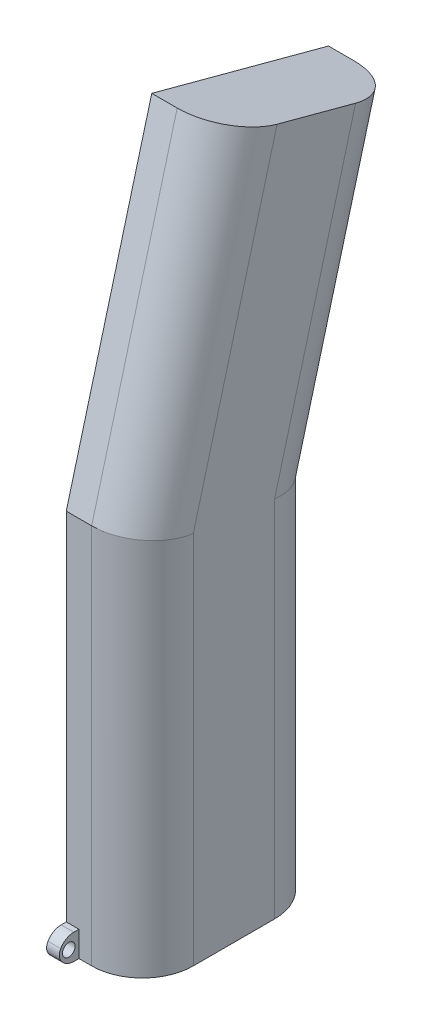
ISO-10303-21;
HEADER;
FILE_DESCRIPTION(('STEP AP214'),'2;1');
FILE_NAME('part.step','',(''),(''),'','','');
FILE_SCHEMA(('AUTOMOTIVE_DESIGN { 1 0 10303 214 1 1 1 1 }'));
ENDSEC;
DATA;
#1=APPLICATION_CONTEXT('core data for automotive mechanical design processes');
#2=APPLICATION_PROTOCOL_DEFINITION('international standard','automotive_design',2000,#1);
#3=PRODUCT_CONTEXT('',#1,'mechanical');
#4=PRODUCT('Part','Part','',(#3));
#5=PRODUCT_RELATED_PRODUCT_CATEGORY('part','',(#4));
#6=PRODUCT_DEFINITION_FORMATION('','',#4);
#7=PRODUCT_DEFINITION_CONTEXT('part definition',#1,'design');
#8=PRODUCT_DEFINITION('design','',#6,#7);
#9=PRODUCT_DEFINITION_SHAPE('','',#8);
#10=(LENGTH_UNIT() NAMED_UNIT(*) SI_UNIT(.MILLI.,.METRE.));
#11=(NAMED_UNIT(*) PLANE_ANGLE_UNIT() SI_UNIT($,.RADIAN.));
#12=(NAMED_UNIT(*) SI_UNIT($,.STERADIAN.) SOLID_ANGLE_UNIT());
#13=UNCERTAINTY_MEASURE_WITH_UNIT(LENGTH_MEASURE(1.E-05),#10,'distance_accuracy_value','');
#14=(GEOMETRIC_REPRESENTATION_CONTEXT(3) GLOBAL_UNCERTAINTY_ASSIGNED_CONTEXT((#13)) GLOBAL_UNIT_ASSIGNED_CONTEXT((#10,
#11,#12)) REPRESENTATION_CONTEXT('',''));
#15=CARTESIAN_POINT('',(0.,0.,0.));
#16=DIRECTION('',(0.,0.,1.));
#17=DIRECTION('',(1.,0.,0.));
#18=AXIS2_PLACEMENT_3D('',#15,#16,#17);
#19=CARTESIAN_POINT('',(15.,0.,-18.));
#20=DIRECTION('',(0.,0.,1.));
#21=DIRECTION('',(-1.,0.,0.));
#22=AXIS2_PLACEMENT_3D('',#19,#20,#21);
#23=PLANE('',#22);
#24=DIRECTION('',(0.,1.,0.));
#25=VECTOR('',#24,1.);
#26=CARTESIAN_POINT('',(2.5,0.,-18.));
#27=LINE('',#26,#25);
#28=CARTESIAN_POINT('',(2.5,0.,-18.));
#29=VERTEX_POINT('',#28);
#30=CARTESIAN_POINT('',(2.5,5.,-18.));
#31=VERTEX_POINT('',#30);
#32=EDGE_CURVE('E248',#29,#31,#27,.T.);
#33=ORIENTED_EDGE('',*,*,#32,.T.);
#34=DIRECTION('',(-1.,0.,0.));
#35=VECTOR('',#34,1.);
#36=CARTESIAN_POINT('',(0.,5.,-18.));
#37=LINE('',#36,#35);
#38=CARTESIAN_POINT('',(0.,5.,-18.));
#39=VERTEX_POINT('',#38);
#40=EDGE_CURVE('E259',#31,#39,#37,.T.);
#41=ORIENTED_EDGE('',*,*,#40,.T.);
#42=DIRECTION('',(0.,-1.,0.));
#43=VECTOR('',#42,1.);
#44=CARTESIAN_POINT('',(0.,0.,-18.));
#45=LINE('',#44,#43);
#46=CARTESIAN_POINT('',(0.,70.2605100868536,-18.));
#47=VERTEX_POINT('',#46);
#48=EDGE_CURVE('E360',#47,#39,#45,.T.);
#49=ORIENTED_EDGE('',*,*,#48,.F.);
#50=DIRECTION('',(-1.,0.,0.));
#51=VECTOR('',#50,1.);
#52=CARTESIAN_POINT('',(15.,70.2605100868536,-18.));
#53=LINE('',#52,#51);
#54=CARTESIAN_POINT('',(5.,70.2605100868536,-18.));
#55=VERTEX_POINT('',#54);
#56=EDGE_CURVE('E359',#55,#47,#53,.T.);
#57=ORIENTED_EDGE('',*,*,#56,.F.);
#58=DIRECTION('',(0.,-1.,0.));
#59=VECTOR('',#58,1.);
#60=CARTESIAN_POINT('',(5.,0.,-18.));
#61=LINE('',#60,#59);
#62=CARTESIAN_POINT('',(5.,0.,-18.));
#63=VERTEX_POINT('',#62);
#64=EDGE_CURVE('E251',#63,#55,#61,.F.);
#65=ORIENTED_EDGE('',*,*,#64,.F.);
#66=DIRECTION('',(-1.,0.,0.));
#67=VECTOR('',#66,1.);
#68=CARTESIAN_POINT('',(15.,0.,-18.));
#69=LINE('',#68,#67);
#70=EDGE_CURVE('E235',#63,#29,#69,.T.);
#71=ORIENTED_EDGE('',*,*,#70,.T.);
#72=EDGE_LOOP('',(#33,#41,#49,#57,#65,#71));
#73=FACE_BOUND('',#72,.T.);
#74=ADVANCED_FACE('F35',(#73),#23,.F.);
#75=CARTESIAN_POINT('',(0.,0.,0.));
#76=DIRECTION('',(-1.,0.,0.));
#77=DIRECTION('',(0.,0.,-1.));
#78=AXIS2_PLACEMENT_3D('',#75,#76,#77);
#79=PLANE('',#78);
#80=CARTESIAN_POINT('',(0.,2.5,20.));
#81=DIRECTION('',(1.,0.,0.));
#82=DIRECTION('',(0.,0.,-1.));
#83=AXIS2_PLACEMENT_3D('',#80,#81,#82);
#84=CIRCLE('',#83,1.25);
#85=CARTESIAN_POINT('',(0.,2.5,18.75));
#86=VERTEX_POINT('',#85);
#87=EDGE_CURVE('E495',#86,#86,#84,.T.);
#88=ORIENTED_EDGE('',*,*,#87,.T.);
#89=EDGE_LOOP('',(#88));
#90=FACE_BOUND('',#89,.T.);
#91=CARTESIAN_POINT('',(0.,2.5,-20.));
#92=DIRECTION('',(1.,0.,0.));
#93=DIRECTION('',(0.,0.,-1.));
#94=AXIS2_PLACEMENT_3D('',#91,#92,#93);
#95=CIRCLE('',#94,1.25);
#96=CARTESIAN_POINT('',(0.,2.5,-21.25));
#97=VERTEX_POINT('',#96);
#98=EDGE_CURVE('E265',#97,#97,#95,.F.);
#99=ORIENTED_EDGE('',*,*,#98,.F.);
#100=EDGE_LOOP('',(#99));
#101=FACE_BOUND('',#100,.T.);
#102=CARTESIAN_POINT('',(0.,2.,19.));
#103=DIRECTION('',(1.,0.,0.));
#104=DIRECTION('',(0.,0.,-1.));
#105=AXIS2_PLACEMENT_3D('',#102,#103,#104);
#106=CIRCLE('',#105,3.);
#107=CARTESIAN_POINT('',(0.,5.,19.));
#108=VERTEX_POINT('',#107);
#109=CARTESIAN_POINT('',(0.,3.50000000000001,21.5980762113533));
#110=VERTEX_POINT('',#109);
#111=EDGE_CURVE('E449',#108,#110,#106,.T.);
#112=ORIENTED_EDGE('',*,*,#111,.F.);
#113=DIRECTION('',(0.,0.,-1.));
#114=VECTOR('',#113,1.);
#115=CARTESIAN_POINT('',(0.,5.,22.));
#116=LINE('',#115,#114);
#117=CARTESIAN_POINT('',(0.,5.,18.));
#118=VERTEX_POINT('',#117);
#119=EDGE_CURVE('E473',#108,#118,#116,.T.);
#120=ORIENTED_EDGE('',*,*,#119,.T.);
#121=DIRECTION('',(0.,1.,0.));
#122=VECTOR('',#121,1.);
#123=CARTESIAN_POINT('',(0.,0.,18.));
#124=LINE('',#123,#122);
#125=CARTESIAN_POINT('',(0.,75.,18.));
#126=VERTEX_POINT('',#125);
#127=EDGE_CURVE('E368',#118,#126,#124,.T.);
#128=ORIENTED_EDGE('',*,*,#127,.T.);
#129=DIRECTION('',(0.,0.965925826289067,-0.258819045102525));
#130=VECTOR('',#129,1.);
#131=CARTESIAN_POINT('',(0.,75.,18.));
#132=LINE('',#131,#130);
#133=CARTESIAN_POINT('',(0.,137.785178708789,1.17676206833585));
#134=VERTEX_POINT('',#133);
#135=EDGE_CURVE('E371',#126,#134,#132,.T.);
#136=ORIENTED_EDGE('',*,*,#135,.T.);
#137=DIRECTION('',(0.,-0.258819045102526,-0.965925826289067));
#138=VECTOR('',#137,1.);
#139=CARTESIAN_POINT('',(0.,137.785178708789,1.17676206833585));
#140=LINE('',#139,#138);
#141=CARTESIAN_POINT('',(0.,128.467693085098,-33.5965676780706));
#142=VERTEX_POINT('',#141);
#143=EDGE_CURVE('E374',#134,#142,#140,.T.);
#144=ORIENTED_EDGE('',*,*,#143,.T.);
#145=DIRECTION('',(0.,-0.965925826289067,0.258819045102525));
#146=VECTOR('',#145,1.);
#147=CARTESIAN_POINT('',(0.,70.2605100868536,-18.));
#148=LINE('',#147,#146);
#149=EDGE_CURVE('E356',#142,#47,#148,.T.);
#150=ORIENTED_EDGE('',*,*,#149,.T.);
#151=ORIENTED_EDGE('',*,*,#48,.T.);
#152=DIRECTION('',(0.,0.,1.));
#153=VECTOR('',#152,1.);
#154=CARTESIAN_POINT('',(0.,5.,-22.));
#155=LINE('',#154,#153);
#156=CARTESIAN_POINT('',(0.,5.,-19.));
#157=VERTEX_POINT('',#156);
#158=EDGE_CURVE('E262',#157,#39,#155,.T.);
#159=ORIENTED_EDGE('',*,*,#158,.F.);
#160=CARTESIAN_POINT('',(0.,2.,-19.));
#161=DIRECTION('',(1.,0.,0.));
#162=DIRECTION('',(0.,0.,-1.));
#163=AXIS2_PLACEMENT_3D('',#160,#161,#162);
#164=CIRCLE('',#163,3.);
#165=CARTESIAN_POINT('',(0.,3.5,-21.5980762113533));
#166=VERTEX_POINT('',#165);
#167=EDGE_CURVE('E423',#166,#157,#164,.T.);
#168=ORIENTED_EDGE('',*,*,#167,.F.);
#169=CARTESIAN_POINT('',(0.,2.5,-19.8660254037844));
#170=DIRECTION('',(1.,0.,0.));
#171=DIRECTION('',(0.,0.,-1.));
#172=AXIS2_PLACEMENT_3D('',#169,#170,#171);
#173=CIRCLE('',#172,2.);
#174=CARTESIAN_POINT('',(0.,1.5,-21.5980762113533));
#175=VERTEX_POINT('',#174);
#176=EDGE_CURVE('E433',#175,#166,#173,.T.);
#177=ORIENTED_EDGE('',*,*,#176,.F.);
#178=CARTESIAN_POINT('',(0.,3.,-19.));
#179=DIRECTION('',(1.,0.,0.));
#180=DIRECTION('',(0.,0.,-1.));
#181=AXIS2_PLACEMENT_3D('',#178,#179,#180);
#182=CIRCLE('',#181,3.);
#183=CARTESIAN_POINT('',(0.,0.,-19.));
#184=VERTEX_POINT('',#183);
#185=EDGE_CURVE('E426',#184,#175,#182,.T.);
#186=ORIENTED_EDGE('',*,*,#185,.F.);
#187=DIRECTION('',(0.,0.,1.));
#188=VECTOR('',#187,1.);
#189=CARTESIAN_POINT('',(0.,0.,-18.));
#190=LINE('',#189,#188);
#191=CARTESIAN_POINT('',(0.,0.,-3.1));
#192=VERTEX_POINT('',#191);
#193=EDGE_CURVE('E365',#184,#192,#190,.T.);
#194=ORIENTED_EDGE('',*,*,#193,.T.);
#195=DIRECTION('',(0.,-1.,0.));
#196=VECTOR('',#195,1.);
#197=CARTESIAN_POINT('',(0.,137.786178708789,-3.10000000000003));
#198=LINE('',#197,#196);
#199=CARTESIAN_POINT('',(0.,2.,-3.1));
#200=VERTEX_POINT('',#199);
#201=EDGE_CURVE('E276',#200,#192,#198,.T.);
#202=ORIENTED_EDGE('',*,*,#201,.F.);
#203=DIRECTION('',(0.,0.,1.));
#204=VECTOR('',#203,1.);
#205=CARTESIAN_POINT('',(0.,2.,0.));
#206=LINE('',#205,#204);
#207=CARTESIAN_POINT('',(0.,2.,-16.));
#208=VERTEX_POINT('',#207);
#209=EDGE_CURVE('E349',#208,#200,#206,.T.);
#210=ORIENTED_EDGE('',*,*,#209,.F.);
#211=DIRECTION('',(0.,-1.,0.));
#212=VECTOR('',#211,1.);
#213=CARTESIAN_POINT('',(0.,0.,-16.));
#214=LINE('',#213,#212);
#215=CARTESIAN_POINT('',(0.,70.5238150820284,-16.));
#216=VERTEX_POINT('',#215);
#217=EDGE_CURVE('E325',#216,#208,#214,.T.);
#218=ORIENTED_EDGE('',*,*,#217,.F.);
#219=DIRECTION('',(0.,-0.965925826289067,0.258819045102525));
#220=VECTOR('',#219,1.);
#221=CARTESIAN_POINT('',(0.,0.724199824597937,2.70275054023192));
#222=LINE('',#221,#220);
#223=CARTESIAN_POINT('',(0.,127.053479522725,-31.1470779352874));
#224=VERTEX_POINT('',#223);
#225=EDGE_CURVE('E297',#224,#216,#222,.T.);
#226=ORIENTED_EDGE('',*,*,#225,.F.);
#227=DIRECTION('',(0.,-0.258819045102526,-0.965925826289067));
#228=VECTOR('',#227,1.);
#229=CARTESIAN_POINT('',(0.,126.329279698127,-33.8498284755193));
#230=LINE('',#229,#228);
#231=CARTESIAN_POINT('',(0.,135.335688966006,-0.237451494037231));
#232=VERTEX_POINT('',#231);
#233=EDGE_CURVE('E340',#232,#224,#230,.T.);
#234=ORIENTED_EDGE('',*,*,#233,.F.);
#235=DIRECTION('',(0.,0.965925826289067,-0.258819045102525));
#236=VECTOR('',#235,1.);
#237=CARTESIAN_POINT('',(0.,9.00640926787875,33.6123769814821));
#238=LINE('',#237,#236);
#239=CARTESIAN_POINT('',(0.,74.7366950048252,16.));
#240=VERTEX_POINT('',#239);
#241=EDGE_CURVE('E343',#240,#232,#238,.T.);
#242=ORIENTED_EDGE('',*,*,#241,.F.);
#243=DIRECTION('',(0.,1.,0.));
#244=VECTOR('',#243,1.);
#245=CARTESIAN_POINT('',(0.,0.,16.));
#246=LINE('',#245,#244);
#247=CARTESIAN_POINT('',(0.,2.00000000000001,16.));
#248=VERTEX_POINT('',#247);
#249=EDGE_CURVE('E346',#248,#240,#246,.T.);
#250=ORIENTED_EDGE('',*,*,#249,.F.);
#251=CARTESIAN_POINT('',(0.,2.,3.1));
#252=VERTEX_POINT('',#251);
#253=EDGE_CURVE('E337',#252,#248,#206,.T.);
#254=ORIENTED_EDGE('',*,*,#253,.F.);
#255=DIRECTION('',(0.,-1.,0.));
#256=VECTOR('',#255,1.);
#257=CARTESIAN_POINT('',(0.,137.786178708789,3.09999999999997));
#258=LINE('',#257,#256);
#259=CARTESIAN_POINT('',(0.,0.,3.1));
#260=VERTEX_POINT('',#259);
#261=EDGE_CURVE('E274',#252,#260,#258,.T.);
#262=ORIENTED_EDGE('',*,*,#261,.T.);
#263=CARTESIAN_POINT('',(0.,0.,19.));
#264=VERTEX_POINT('',#263);
#265=EDGE_CURVE('E363',#260,#264,#190,.T.);
#266=ORIENTED_EDGE('',*,*,#265,.T.);
#267=CARTESIAN_POINT('',(0.,3.00000000000001,19.));
#268=DIRECTION('',(1.,0.,0.));
#269=DIRECTION('',(0.,0.,-1.));
#270=AXIS2_PLACEMENT_3D('',#267,#268,#269);
#271=CIRCLE('',#270,3.);
#272=CARTESIAN_POINT('',(0.,1.5,21.5980762113533));
#273=VERTEX_POINT('',#272);
#274=EDGE_CURVE('E451',#273,#264,#271,.T.);
#275=ORIENTED_EDGE('',*,*,#274,.F.);
#276=CARTESIAN_POINT('',(0.,2.5,19.8660254037844));
#277=DIRECTION('',(1.,0.,0.));
#278=DIRECTION('',(0.,0.,-1.));
#279=AXIS2_PLACEMENT_3D('',#276,#277,#278);
#280=CIRCLE('',#279,2.);
#281=EDGE_CURVE('E11',#110,#273,#280,.T.);
#282=ORIENTED_EDGE('',*,*,#281,.F.);
#283=EDGE_LOOP('',(#112,#120,#128,#136,#144,#150,#151,#159,#168,#177,#186,#194,#202,#210,#218,
#226,#234,#242,#250,#254,#262,#266,#275,#282));
#284=FACE_BOUND('',#283,.T.);
#285=ADVANCED_FACE('F479',(#90,#101,#284),#79,.T.);
#286=CARTESIAN_POINT('',(15.,0.,-18.));
#287=DIRECTION('',(0.,1.,0.));
#288=DIRECTION('',(0.,0.,-1.));
#289=AXIS2_PLACEMENT_3D('',#286,#287,#288);
#290=PLANE('',#289);
#291=ORIENTED_EDGE('',*,*,#265,.F.);
#292=CARTESIAN_POINT('',(0.,0.,0.));
#293=DIRECTION('',(0.,1.,0.));
#294=DIRECTION('',(0.,0.,1.));
#295=AXIS2_PLACEMENT_3D('',#292,#293,#294);
#296=CIRCLE('',#295,3.1);
#297=EDGE_CURVE('E271',#260,#192,#296,.T.);
#298=ORIENTED_EDGE('',*,*,#297,.T.);
#299=ORIENTED_EDGE('',*,*,#193,.F.);
#300=DIRECTION('',(1.,0.,0.));
#301=VECTOR('',#300,1.);
#302=CARTESIAN_POINT('',(15.,0.,-19.));
#303=LINE('',#302,#301);
#304=CARTESIAN_POINT('',(2.5,0.,-19.));
#305=VERTEX_POINT('',#304);
#306=EDGE_CURVE('E238',#305,#184,#303,.F.);
#307=ORIENTED_EDGE('',*,*,#306,.F.);
#308=DIRECTION('',(0.,0.,1.));
#309=VECTOR('',#308,1.);
#310=CARTESIAN_POINT('',(2.5,0.,-22.));
#311=LINE('',#310,#309);
#312=EDGE_CURVE('E230',#305,#29,#311,.T.);
#313=ORIENTED_EDGE('',*,*,#312,.T.);
#314=ORIENTED_EDGE('',*,*,#70,.F.);
#315=CARTESIAN_POINT('',(5.,0.,-8.));
#316=DIRECTION('',(0.,-1.,0.));
#317=DIRECTION('',(0.,0.,-1.));
#318=AXIS2_PLACEMENT_3D('',#315,#316,#317);
#319=CIRCLE('',#318,10.);
#320=CARTESIAN_POINT('',(15.,0.,-8.));
#321=VERTEX_POINT('',#320);
#322=EDGE_CURVE('E400',#321,#63,#319,.F.);
#323=ORIENTED_EDGE('',*,*,#322,.F.);
#324=DIRECTION('',(0.,0.,1.));
#325=VECTOR('',#324,1.);
#326=CARTESIAN_POINT('',(15.,0.,-18.));
#327=LINE('',#326,#325);
#328=CARTESIAN_POINT('',(15.,0.,8.));
#329=VERTEX_POINT('',#328);
#330=EDGE_CURVE('E352',#321,#329,#327,.T.);
#331=ORIENTED_EDGE('',*,*,#330,.T.);
#332=CARTESIAN_POINT('',(5.,0.,8.));
#333=DIRECTION('',(0.,-1.,0.));
#334=DIRECTION('',(0.,0.,-1.));
#335=AXIS2_PLACEMENT_3D('',#332,#333,#334);
#336=CIRCLE('',#335,10.);
#337=CARTESIAN_POINT('',(5.,0.,18.));
#338=VERTEX_POINT('',#337);
#339=EDGE_CURVE('E397',#338,#329,#336,.F.);
#340=ORIENTED_EDGE('',*,*,#339,.F.);
#341=DIRECTION('',(-1.,0.,0.));
#342=VECTOR('',#341,1.);
#343=CARTESIAN_POINT('',(15.,0.,18.));
#344=LINE('',#343,#342);
#345=CARTESIAN_POINT('',(2.5,0.,18.));
#346=VERTEX_POINT('',#345);
#347=EDGE_CURVE('E253',#338,#346,#344,.T.);
#348=ORIENTED_EDGE('',*,*,#347,.T.);
#349=DIRECTION('',(0.,0.,-1.));
#350=VECTOR('',#349,1.);
#351=CARTESIAN_POINT('',(2.5,0.,22.));
#352=LINE('',#351,#350);
#353=CARTESIAN_POINT('',(2.5,0.,19.));
#354=VERTEX_POINT('',#353);
#355=EDGE_CURVE('E486',#354,#346,#352,.T.);
#356=ORIENTED_EDGE('',*,*,#355,.F.);
#357=DIRECTION('',(1.,0.,0.));
#358=VECTOR('',#357,1.);
#359=CARTESIAN_POINT('',(15.,0.,19.));
#360=LINE('',#359,#358);
#361=EDGE_CURVE('E441',#264,#354,#360,.T.);
#362=ORIENTED_EDGE('',*,*,#361,.F.);
#363=EDGE_LOOP('',(#291,#298,#299,#307,#313,#314,#323,#331,#340,#348,#356,#362));
#364=FACE_BOUND('',#363,.T.);
#365=ADVANCED_FACE('F233',(#364),#290,.F.);
#366=CARTESIAN_POINT('',(15.,0.,18.));
#367=DIRECTION('',(0.,0.,-1.));
#368=DIRECTION('',(1.,0.,0.));
#369=AXIS2_PLACEMENT_3D('',#366,#367,#368);
#370=PLANE('',#369);
#371=DIRECTION('',(0.,1.,0.));
#372=VECTOR('',#371,1.);
#373=CARTESIAN_POINT('',(2.5,0.,18.));
#374=LINE('',#373,#372);
#375=CARTESIAN_POINT('',(2.5,5.,18.));
#376=VERTEX_POINT('',#375);
#377=EDGE_CURVE('E487',#346,#376,#374,.T.);
#378=ORIENTED_EDGE('',*,*,#377,.F.);
#379=ORIENTED_EDGE('',*,*,#347,.F.);
#380=DIRECTION('',(0.,1.,0.));
#381=VECTOR('',#380,1.);
#382=CARTESIAN_POINT('',(5.,0.,18.));
#383=LINE('',#382,#381);
#384=CARTESIAN_POINT('',(5.,75.,18.));
#385=VERTEX_POINT('',#384);
#386=EDGE_CURVE('E413',#385,#338,#383,.F.);
#387=ORIENTED_EDGE('',*,*,#386,.F.);
#388=DIRECTION('',(-1.,0.,0.));
#389=VECTOR('',#388,1.);
#390=CARTESIAN_POINT('',(15.,75.,18.));
#391=LINE('',#390,#389);
#392=EDGE_CURVE('E384',#385,#126,#391,.T.);
#393=ORIENTED_EDGE('',*,*,#392,.T.);
#394=ORIENTED_EDGE('',*,*,#127,.F.);
#395=DIRECTION('',(-1.,0.,0.));
#396=VECTOR('',#395,1.);
#397=CARTESIAN_POINT('',(0.,5.,18.));
#398=LINE('',#397,#396);
#399=EDGE_CURVE('E475',#376,#118,#398,.T.);
#400=ORIENTED_EDGE('',*,*,#399,.F.);
#401=EDGE_LOOP('',(#378,#379,#387,#393,#394,#400));
#402=FACE_BOUND('',#401,.T.);
#403=ADVANCED_FACE('F493',(#402),#370,.F.);
#404=CARTESIAN_POINT('',(15.,75.,18.));
#405=DIRECTION('',(0.,-0.258819045102525,-0.965925826289067));
#406=DIRECTION('',(0.,-0.965925826289067,0.258819045102525));
#407=AXIS2_PLACEMENT_3D('',#404,#405,#406);
#408=PLANE('',#407);
#409=DIRECTION('',(-1.,0.,0.));
#410=VECTOR('',#409,1.);
#411=CARTESIAN_POINT('',(15.,137.785178708789,1.17676206833585));
#412=LINE('',#411,#410);
#413=CARTESIAN_POINT('',(5.,137.785178708789,1.17676206833585));
#414=VERTEX_POINT('',#413);
#415=EDGE_CURVE('E382',#414,#134,#412,.T.);
#416=ORIENTED_EDGE('',*,*,#415,.T.);
#417=ORIENTED_EDGE('',*,*,#135,.F.);
#418=ORIENTED_EDGE('',*,*,#392,.F.);
#419=DIRECTION('',(0.,0.965925826289067,-0.258819045102525));
#420=VECTOR('',#419,1.);
#421=CARTESIAN_POINT('',(5.,75.,18.));
#422=LINE('',#421,#420);
#423=EDGE_CURVE('E410',#414,#385,#422,.F.);
#424=ORIENTED_EDGE('',*,*,#423,.F.);
#425=EDGE_LOOP('',(#416,#417,#418,#424));
#426=FACE_BOUND('',#425,.T.);
#427=ADVANCED_FACE('F803',(#426),#408,.F.);
#428=CARTESIAN_POINT('',(15.,137.785178708789,1.17676206833585));
#429=DIRECTION('',(0.,-0.965925826289067,0.258819045102526));
#430=DIRECTION('',(0.,0.258819045102526,0.965925826289067));
#431=AXIS2_PLACEMENT_3D('',#428,#429,#430);
#432=PLANE('',#431);
#433=DIRECTION('',(-1.,0.,0.));
#434=VECTOR('',#433,1.);
#435=CARTESIAN_POINT('',(15.,128.467693085098,-33.5965676780706));
#436=LINE('',#435,#434);
#437=CARTESIAN_POINT('',(5.,128.467693085098,-33.5965676780706));
#438=VERTEX_POINT('',#437);
#439=EDGE_CURVE('E380',#438,#142,#436,.T.);
#440=ORIENTED_EDGE('',*,*,#439,.T.);
#441=ORIENTED_EDGE('',*,*,#143,.F.);
#442=ORIENTED_EDGE('',*,*,#415,.F.);
#443=CARTESIAN_POINT('',(5.,135.196988257764,-8.48249619455483));
#444=DIRECTION('',(0.,0.965925826289067,-0.258819045102526));
#445=DIRECTION('',(0.,0.258819045102526,0.965925826289067));
#446=AXIS2_PLACEMENT_3D('',#443,#444,#445);
#447=CIRCLE('',#446,10.);
#448=CARTESIAN_POINT('',(15.,135.196988257764,-8.48249619455482));
#449=VERTEX_POINT('',#448);
#450=EDGE_CURVE('E405',#449,#414,#447,.F.);
#451=ORIENTED_EDGE('',*,*,#450,.F.);
#452=DIRECTION('',(0.,-0.258819045102526,-0.965925826289067));
#453=VECTOR('',#452,1.);
#454=CARTESIAN_POINT('',(15.,137.785178708789,1.17676206833585));
#455=LINE('',#454,#453);
#456=CARTESIAN_POINT('',(15.,131.055883536124,-23.9373094151799));
#457=VERTEX_POINT('',#456);
#458=EDGE_CURVE('E355',#449,#457,#455,.T.);
#459=ORIENTED_EDGE('',*,*,#458,.T.);
#460=CARTESIAN_POINT('',(5.,131.055883536124,-23.9373094151799));
#461=DIRECTION('',(0.,0.965925826289067,-0.258819045102526));
#462=DIRECTION('',(0.,0.258819045102526,0.965925826289067));
#463=AXIS2_PLACEMENT_3D('',#460,#461,#462);
#464=CIRCLE('',#463,10.);
#465=EDGE_CURVE('E407',#438,#457,#464,.F.);
#466=ORIENTED_EDGE('',*,*,#465,.F.);
#467=EDGE_LOOP('',(#440,#441,#442,#451,#459,#466));
#468=FACE_BOUND('',#467,.T.);
#469=ADVANCED_FACE('F793',(#468),#432,.F.);
#470=CARTESIAN_POINT('',(15.,70.2605100868536,-18.));
#471=DIRECTION('',(0.,0.258819045102525,0.965925826289067));
#472=DIRECTION('',(0.,0.965925826289067,-0.258819045102525));
#473=AXIS2_PLACEMENT_3D('',#470,#471,#472);
#474=PLANE('',#473);
#475=ORIENTED_EDGE('',*,*,#56,.T.);
#476=ORIENTED_EDGE('',*,*,#149,.F.);
#477=ORIENTED_EDGE('',*,*,#439,.F.);
#478=DIRECTION('',(0.,-0.965925826289067,0.258819045102525));
#479=VECTOR('',#478,1.);
#480=CARTESIAN_POINT('',(5.,70.2605100868536,-18.));
#481=LINE('',#480,#479);
#482=EDGE_CURVE('E403',#55,#438,#481,.F.);
#483=ORIENTED_EDGE('',*,*,#482,.F.);
#484=EDGE_LOOP('',(#475,#476,#477,#483));
#485=FACE_BOUND('',#484,.T.);
#486=ADVANCED_FACE('F783',(#485),#474,.F.);
#487=CARTESIAN_POINT('',(15.,0.,0.));
#488=DIRECTION('',(-1.,0.,0.));
#489=DIRECTION('',(0.,0.,-1.));
#490=AXIS2_PLACEMENT_3D('',#487,#488,#489);
#491=PLANE('',#490);
#492=DIRECTION('',(0.,-0.965925826289067,0.258819045102525));
#493=VECTOR('',#492,1.);
#494=CARTESIAN_POINT('',(15.,2.79475218541814,10.4301571505445));
#495=LINE('',#494,#493);
#496=CARTESIAN_POINT('',(15.,71.5770350627276,-8.));
#497=VERTEX_POINT('',#496);
#498=EDGE_CURVE('E392',#457,#497,#495,.T.);
#499=ORIENTED_EDGE('',*,*,#498,.F.);
#500=ORIENTED_EDGE('',*,*,#458,.F.);
#501=DIRECTION('',(0.,0.965925826289067,-0.258819045102525));
#502=VECTOR('',#501,1.);
#503=CARTESIAN_POINT('',(15.,6.93585690705854,25.8849703711695));
#504=LINE('',#503,#502);
#505=CARTESIAN_POINT('',(15.,73.683475024126,8.));
#506=VERTEX_POINT('',#505);
#507=EDGE_CURVE('E390',#506,#449,#504,.T.);
#508=ORIENTED_EDGE('',*,*,#507,.F.);
#509=DIRECTION('',(0.,1.,0.));
#510=VECTOR('',#509,1.);
#511=CARTESIAN_POINT('',(15.,0.,8.));
#512=LINE('',#511,#510);
#513=EDGE_CURVE('E252',#329,#506,#512,.T.);
#514=ORIENTED_EDGE('',*,*,#513,.F.);
#515=ORIENTED_EDGE('',*,*,#330,.F.);
#516=DIRECTION('',(0.,-1.,0.));
#517=VECTOR('',#516,1.);
#518=CARTESIAN_POINT('',(15.,0.,-8.));
#519=LINE('',#518,#517);
#520=EDGE_CURVE('E395',#497,#321,#519,.T.);
#521=ORIENTED_EDGE('',*,*,#520,.F.);
#522=EDGE_LOOP('',(#499,#500,#508,#514,#515,#521));
#523=FACE_BOUND('',#522,.T.);
#524=ADVANCED_FACE('F536',(#523),#491,.F.);
#525=CARTESIAN_POINT('',(5.,2.79475218541814,10.4301571505445));
#526=DIRECTION('',(0.,-0.965925826289067,0.258819045102525));
#527=DIRECTION('',(0.,0.258819045102525,0.965925826289067));
#528=AXIS2_PLACEMENT_3D('',#525,#526,#527);
#529=CYLINDRICAL_SURFACE('',#528,10.);
#530=ORIENTED_EDGE('',*,*,#465,.T.);
#531=ORIENTED_EDGE('',*,*,#498,.T.);
#532=CARTESIAN_POINT('',(5.,71.5770350627276,-8.));
#533=DIRECTION('',(0.,0.99144486137381,-0.130526192220054));
#534=DIRECTION('',(0.,-0.130526192220054,-0.99144486137381));
#535=AXIS2_PLACEMENT_3D('',#532,#533,#534);
#536=ELLIPSE('',#535,10.0862896058015,10.);
#537=EDGE_CURVE('E364',#497,#55,#536,.T.);
#538=ORIENTED_EDGE('',*,*,#537,.T.);
#539=ORIENTED_EDGE('',*,*,#482,.T.);
#540=EDGE_LOOP('',(#530,#531,#538,#539));
#541=FACE_BOUND('',#540,.T.);
#542=ADVANCED_FACE('F532',(#541),#529,.T.);
#543=CARTESIAN_POINT('',(5.,0.,-8.));
#544=DIRECTION('',(0.,-1.,0.));
#545=DIRECTION('',(0.,0.,1.));
#546=AXIS2_PLACEMENT_3D('',#543,#544,#545);
#547=CYLINDRICAL_SURFACE('',#546,10.);
#548=ORIENTED_EDGE('',*,*,#537,.F.);
#549=ORIENTED_EDGE('',*,*,#520,.T.);
#550=ORIENTED_EDGE('',*,*,#322,.T.);
#551=ORIENTED_EDGE('',*,*,#64,.T.);
#552=EDGE_LOOP('',(#548,#549,#550,#551));
#553=FACE_BOUND('',#552,.T.);
#554=ADVANCED_FACE('F528',(#553),#547,.T.);
#555=CARTESIAN_POINT('',(5.,0.,8.));
#556=DIRECTION('',(0.,1.,0.));
#557=DIRECTION('',(0.,0.,-1.));
#558=AXIS2_PLACEMENT_3D('',#555,#556,#557);
#559=CYLINDRICAL_SURFACE('',#558,10.);
#560=ORIENTED_EDGE('',*,*,#339,.T.);
#561=ORIENTED_EDGE('',*,*,#513,.T.);
#562=CARTESIAN_POINT('',(5.,73.683475024126,8.));
#563=DIRECTION('',(0.,-0.99144486137381,0.130526192220054));
#564=DIRECTION('',(0.,0.130526192220054,0.99144486137381));
#565=AXIS2_PLACEMENT_3D('',#562,#563,#564);
#566=ELLIPSE('',#565,10.0862896058015,10.);
#567=EDGE_CURVE('E309',#506,#385,#566,.T.);
#568=ORIENTED_EDGE('',*,*,#567,.T.);
#569=ORIENTED_EDGE('',*,*,#386,.T.);
#570=EDGE_LOOP('',(#560,#561,#568,#569));
#571=FACE_BOUND('',#570,.T.);
#572=ADVANCED_FACE('F531',(#571),#559,.T.);
#573=CARTESIAN_POINT('',(5.,6.93585690705855,25.8849703711695));
#574=DIRECTION('',(0.,0.965925826289067,-0.258819045102525));
#575=DIRECTION('',(0.,-0.258819045102525,-0.965925826289067));
#576=AXIS2_PLACEMENT_3D('',#573,#574,#575);
#577=CYLINDRICAL_SURFACE('',#576,10.);
#578=ORIENTED_EDGE('',*,*,#567,.F.);
#579=ORIENTED_EDGE('',*,*,#507,.T.);
#580=ORIENTED_EDGE('',*,*,#450,.T.);
#581=ORIENTED_EDGE('',*,*,#423,.T.);
#582=EDGE_LOOP('',(#578,#579,#580,#581));
#583=FACE_BOUND('',#582,.T.);
#584=ADVANCED_FACE('F538',(#583),#577,.T.);
#585=CARTESIAN_POINT('',(15.,0.,-16.));
#586=DIRECTION('',(0.,0.,1.));
#587=DIRECTION('',(-1.,0.,0.));
#588=AXIS2_PLACEMENT_3D('',#585,#586,#587);
#589=PLANE('',#588);
#590=DIRECTION('',(-1.,0.,0.));
#591=VECTOR('',#590,1.);
#592=CARTESIAN_POINT('',(15.,2.,-16.));
#593=LINE('',#592,#591);
#594=CARTESIAN_POINT('',(5.,2.,-16.));
#595=VERTEX_POINT('',#594);
#596=EDGE_CURVE('E281',#595,#208,#593,.T.);
#597=ORIENTED_EDGE('',*,*,#596,.F.);
#598=DIRECTION('',(0.,1.,0.));
#599=VECTOR('',#598,1.);
#600=CARTESIAN_POINT('',(5.,0.,-16.));
#601=LINE('',#600,#599);
#602=CARTESIAN_POINT('',(5.,70.5238150820284,-16.));
#603=VERTEX_POINT('',#602);
#604=EDGE_CURVE('E285',#595,#603,#601,.T.);
#605=ORIENTED_EDGE('',*,*,#604,.T.);
#606=DIRECTION('',(-1.,0.,0.));
#607=VECTOR('',#606,1.);
#608=CARTESIAN_POINT('',(15.,70.5238150820284,-16.));
#609=LINE('',#608,#607);
#610=EDGE_CURVE('E290',#603,#216,#609,.T.);
#611=ORIENTED_EDGE('',*,*,#610,.T.);
#612=ORIENTED_EDGE('',*,*,#217,.T.);
#613=EDGE_LOOP('',(#597,#605,#611,#612));
#614=FACE_BOUND('',#613,.T.);
#615=ADVANCED_FACE('F541',(#614),#589,.T.);
#616=CARTESIAN_POINT('',(15.,2.,-18.));
#617=DIRECTION('',(0.,1.,0.));
#618=DIRECTION('',(0.,0.,-1.));
#619=AXIS2_PLACEMENT_3D('',#616,#617,#618);
#620=PLANE('',#619);
#621=CARTESIAN_POINT('',(0.,2.,0.));
#622=DIRECTION('',(0.,-1.,0.));
#623=DIRECTION('',(0.,0.,-1.));
#624=AXIS2_PLACEMENT_3D('',#621,#622,#623);
#625=CIRCLE('',#624,3.1);
#626=EDGE_CURVE('E242',#252,#200,#625,.F.);
#627=ORIENTED_EDGE('',*,*,#626,.F.);
#628=ORIENTED_EDGE('',*,*,#253,.T.);
#629=DIRECTION('',(-1.,0.,0.));
#630=VECTOR('',#629,1.);
#631=CARTESIAN_POINT('',(15.,2.00000000000001,16.));
#632=LINE('',#631,#630);
#633=CARTESIAN_POINT('',(5.,2.00000000000001,16.));
#634=VERTEX_POINT('',#633);
#635=EDGE_CURVE('E284',#634,#248,#632,.T.);
#636=ORIENTED_EDGE('',*,*,#635,.F.);
#637=CARTESIAN_POINT('',(5.,2.00000000000001,8.));
#638=DIRECTION('',(0.,-1.,0.));
#639=DIRECTION('',(0.,0.,-1.));
#640=AXIS2_PLACEMENT_3D('',#637,#638,#639);
#641=CIRCLE('',#640,8.);
#642=CARTESIAN_POINT('',(13.,2.00000000000001,8.));
#643=VERTEX_POINT('',#642);
#644=EDGE_CURVE('E299',#634,#643,#641,.F.);
#645=ORIENTED_EDGE('',*,*,#644,.T.);
#646=DIRECTION('',(0.,0.,1.));
#647=VECTOR('',#646,1.);
#648=CARTESIAN_POINT('',(13.,2.,0.));
#649=LINE('',#648,#647);
#650=CARTESIAN_POINT('',(13.,2.,-8.));
#651=VERTEX_POINT('',#650);
#652=EDGE_CURVE('E294',#651,#643,#649,.T.);
#653=ORIENTED_EDGE('',*,*,#652,.F.);
#654=CARTESIAN_POINT('',(5.,2.,-8.));
#655=DIRECTION('',(0.,-1.,0.));
#656=DIRECTION('',(0.,0.,-1.));
#657=AXIS2_PLACEMENT_3D('',#654,#655,#656);
#658=CIRCLE('',#657,8.);
#659=EDGE_CURVE('E289',#651,#595,#658,.F.);
#660=ORIENTED_EDGE('',*,*,#659,.T.);
#661=ORIENTED_EDGE('',*,*,#596,.T.);
#662=ORIENTED_EDGE('',*,*,#209,.T.);
#663=EDGE_LOOP('',(#627,#628,#636,#645,#653,#660,#661,#662));
#664=FACE_BOUND('',#663,.T.);
#665=ADVANCED_FACE('F731',(#664),#620,.T.);
#666=CARTESIAN_POINT('',(15.,0.,16.));
#667=DIRECTION('',(0.,0.,-1.));
#668=DIRECTION('',(1.,0.,0.));
#669=AXIS2_PLACEMENT_3D('',#666,#667,#668);
#670=PLANE('',#669);
#671=DIRECTION('',(-1.,0.,0.));
#672=VECTOR('',#671,1.);
#673=CARTESIAN_POINT('',(15.,74.7366950048252,16.));
#674=LINE('',#673,#672);
#675=CARTESIAN_POINT('',(5.,74.7366950048252,16.));
#676=VERTEX_POINT('',#675);
#677=EDGE_CURVE('E301',#676,#240,#674,.T.);
#678=ORIENTED_EDGE('',*,*,#677,.F.);
#679=DIRECTION('',(0.,1.,0.));
#680=VECTOR('',#679,1.);
#681=CARTESIAN_POINT('',(5.,0.,16.));
#682=LINE('',#681,#680);
#683=EDGE_CURVE('E307',#676,#634,#682,.F.);
#684=ORIENTED_EDGE('',*,*,#683,.T.);
#685=ORIENTED_EDGE('',*,*,#635,.T.);
#686=ORIENTED_EDGE('',*,*,#249,.T.);
#687=EDGE_LOOP('',(#678,#684,#685,#686));
#688=FACE_BOUND('',#687,.T.);
#689=ADVANCED_FACE('F721',(#688),#670,.T.);
#690=CARTESIAN_POINT('',(15.,74.4823619097949,16.0681483474219));
#691=DIRECTION('',(0.,-0.258819045102525,-0.965925826289067));
#692=DIRECTION('',(0.,-0.965925826289067,0.258819045102525));
#693=AXIS2_PLACEMENT_3D('',#690,#691,#692);
#694=PLANE('',#693);
#695=DIRECTION('',(-1.,0.,0.));
#696=VECTOR('',#695,1.);
#697=CARTESIAN_POINT('',(15.,135.335688966006,-0.237451494037229));
#698=LINE('',#697,#696);
#699=CARTESIAN_POINT('',(5.,135.335688966006,-0.237451494037234));
#700=VERTEX_POINT('',#699);
#701=EDGE_CURVE('E306',#700,#232,#698,.T.);
#702=ORIENTED_EDGE('',*,*,#701,.F.);
#703=DIRECTION('',(0.,-0.965925826289067,0.258819045102525));
#704=VECTOR('',#703,1.);
#705=CARTESIAN_POINT('',(5.,74.4823619097949,16.0681483474219));
#706=LINE('',#705,#704);
#707=EDGE_CURVE('E310',#700,#676,#706,.T.);
#708=ORIENTED_EDGE('',*,*,#707,.T.);
#709=ORIENTED_EDGE('',*,*,#677,.T.);
#710=ORIENTED_EDGE('',*,*,#241,.T.);
#711=EDGE_LOOP('',(#702,#708,#709,#710));
#712=FACE_BOUND('',#711,.T.);
#713=ADVANCED_FACE('F711',(#712),#694,.T.);
#714=CARTESIAN_POINT('',(15.,135.853327056211,1.6944001585409));
#715=DIRECTION('',(0.,-0.965925826289067,0.258819045102526));
#716=DIRECTION('',(0.,0.258819045102526,0.965925826289067));
#717=AXIS2_PLACEMENT_3D('',#714,#715,#716);
#718=PLANE('',#717);
#719=DIRECTION('',(-1.,0.,0.));
#720=VECTOR('',#719,1.);
#721=CARTESIAN_POINT('',(15.,127.053479522725,-31.1470779352874));
#722=LINE('',#721,#720);
#723=CARTESIAN_POINT('',(5.,127.053479522725,-31.1470779352874));
#724=VERTEX_POINT('',#723);
#725=EDGE_CURVE('E292',#724,#224,#722,.T.);
#726=ORIENTED_EDGE('',*,*,#725,.F.);
#727=CARTESIAN_POINT('',(5.,129.124031883546,-23.4196713249749));
#728=DIRECTION('',(0.,0.965925826289067,-0.258819045102526));
#729=DIRECTION('',(0.,0.258819045102526,0.965925826289067));
#730=AXIS2_PLACEMENT_3D('',#727,#728,#729);
#731=CIRCLE('',#730,8.);
#732=CARTESIAN_POINT('',(13.,129.124031883546,-23.4196713249749));
#733=VERTEX_POINT('',#732);
#734=EDGE_CURVE('E314',#724,#733,#731,.F.);
#735=ORIENTED_EDGE('',*,*,#734,.T.);
#736=DIRECTION('',(0.,-0.258819045102526,-0.965925826289067));
#737=VECTOR('',#736,1.);
#738=CARTESIAN_POINT('',(13.,126.329279698127,-33.8498284755193));
#739=LINE('',#738,#737);
#740=CARTESIAN_POINT('',(13.,133.265136605186,-7.96485810434978));
#741=VERTEX_POINT('',#740);
#742=EDGE_CURVE('E293',#741,#733,#739,.T.);
#743=ORIENTED_EDGE('',*,*,#742,.F.);
#744=CARTESIAN_POINT('',(5.,133.265136605186,-7.96485810434977));
#745=DIRECTION('',(0.,0.965925826289067,-0.258819045102526));
#746=DIRECTION('',(0.,0.258819045102526,0.965925826289067));
#747=AXIS2_PLACEMENT_3D('',#744,#745,#746);
#748=CIRCLE('',#747,8.);
#749=EDGE_CURVE('E318',#741,#700,#748,.F.);
#750=ORIENTED_EDGE('',*,*,#749,.T.);
#751=ORIENTED_EDGE('',*,*,#701,.T.);
#752=ORIENTED_EDGE('',*,*,#233,.T.);
#753=EDGE_LOOP('',(#726,#735,#743,#750,#751,#752));
#754=FACE_BOUND('',#753,.T.);
#755=ADVANCED_FACE('F701',(#754),#718,.T.);
#756=CARTESIAN_POINT('',(15.,70.7781481770587,-16.0681483474219));
#757=DIRECTION('',(0.,0.258819045102525,0.965925826289067));
#758=DIRECTION('',(0.,0.965925826289067,-0.258819045102525));
#759=AXIS2_PLACEMENT_3D('',#756,#757,#758);
#760=PLANE('',#759);
#761=ORIENTED_EDGE('',*,*,#610,.F.);
#762=DIRECTION('',(0.,0.965925826289067,-0.258819045102525));
#763=VECTOR('',#762,1.);
#764=CARTESIAN_POINT('',(5.,70.7781481770587,-16.0681483474219));
#765=LINE('',#764,#763);
#766=EDGE_CURVE('E288',#603,#724,#765,.T.);
#767=ORIENTED_EDGE('',*,*,#766,.T.);
#768=ORIENTED_EDGE('',*,*,#725,.T.);
#769=ORIENTED_EDGE('',*,*,#225,.T.);
#770=EDGE_LOOP('',(#761,#767,#768,#769));
#771=FACE_BOUND('',#770,.T.);
#772=ADVANCED_FACE('F691',(#771),#760,.T.);
#773=CARTESIAN_POINT('',(13.,0.,0.));
#774=DIRECTION('',(-1.,0.,0.));
#775=DIRECTION('',(0.,0.,-1.));
#776=AXIS2_PLACEMENT_3D('',#773,#774,#775);
#777=PLANE('',#776);
#778=DIRECTION('',(0.,-0.965925826289067,0.258819045102525));
#779=VECTOR('',#778,1.);
#780=CARTESIAN_POINT('',(13.,2.79475218541814,10.4301571505445));
#781=LINE('',#780,#779);
#782=CARTESIAN_POINT('',(13.,71.5770350627276,-8.));
#783=VERTEX_POINT('',#782);
#784=EDGE_CURVE('E326',#733,#783,#781,.T.);
#785=ORIENTED_EDGE('',*,*,#784,.T.);
#786=DIRECTION('',(0.,1.,0.));
#787=VECTOR('',#786,1.);
#788=CARTESIAN_POINT('',(13.,0.,-8.));
#789=LINE('',#788,#787);
#790=EDGE_CURVE('E304',#783,#651,#789,.F.);
#791=ORIENTED_EDGE('',*,*,#790,.T.);
#792=ORIENTED_EDGE('',*,*,#652,.T.);
#793=DIRECTION('',(0.,1.,0.));
#794=VECTOR('',#793,1.);
#795=CARTESIAN_POINT('',(13.,0.,8.));
#796=LINE('',#795,#794);
#797=CARTESIAN_POINT('',(13.,73.683475024126,8.));
#798=VERTEX_POINT('',#797);
#799=EDGE_CURVE('E283',#643,#798,#796,.T.);
#800=ORIENTED_EDGE('',*,*,#799,.T.);
#801=DIRECTION('',(0.,0.965925826289067,-0.258819045102525));
#802=VECTOR('',#801,1.);
#803=CARTESIAN_POINT('',(13.,6.93585690705854,25.8849703711695));
#804=LINE('',#803,#802);
#805=EDGE_CURVE('E329',#798,#741,#804,.T.);
#806=ORIENTED_EDGE('',*,*,#805,.T.);
#807=ORIENTED_EDGE('',*,*,#742,.T.);
#808=EDGE_LOOP('',(#785,#791,#792,#800,#806,#807));
#809=FACE_BOUND('',#808,.T.);
#810=ADVANCED_FACE('F681',(#809),#777,.T.);
#811=CARTESIAN_POINT('',(5.,2.79475218541814,10.4301571505445));
#812=DIRECTION('',(0.,-0.965925826289067,0.258819045102525));
#813=DIRECTION('',(0.,0.258819045102525,0.965925826289067));
#814=AXIS2_PLACEMENT_3D('',#811,#812,#813);
#815=CYLINDRICAL_SURFACE('',#814,8.);
#816=ORIENTED_EDGE('',*,*,#734,.F.);
#817=ORIENTED_EDGE('',*,*,#766,.F.);
#818=CARTESIAN_POINT('',(5.,71.5770350627276,-8.));
#819=DIRECTION('',(0.,0.99144486137381,-0.130526192220054));
#820=DIRECTION('',(0.,0.130526192220054,0.99144486137381));
#821=AXIS2_PLACEMENT_3D('',#818,#819,#820);
#822=ELLIPSE('',#821,8.06903168464122,8.);
#823=EDGE_CURVE('E323',#783,#603,#822,.T.);
#824=ORIENTED_EDGE('',*,*,#823,.F.);
#825=ORIENTED_EDGE('',*,*,#784,.F.);
#826=EDGE_LOOP('',(#816,#817,#824,#825));
#827=FACE_BOUND('',#826,.T.);
#828=ADVANCED_FACE('F671',(#827),#815,.F.);
#829=CARTESIAN_POINT('',(5.,0.,-8.));
#830=DIRECTION('',(0.,-1.,0.));
#831=DIRECTION('',(0.,0.,1.));
#832=AXIS2_PLACEMENT_3D('',#829,#830,#831);
#833=CYLINDRICAL_SURFACE('',#832,8.);
#834=ORIENTED_EDGE('',*,*,#823,.T.);
#835=ORIENTED_EDGE('',*,*,#604,.F.);
#836=ORIENTED_EDGE('',*,*,#659,.F.);
#837=ORIENTED_EDGE('',*,*,#790,.F.);
#838=EDGE_LOOP('',(#834,#835,#836,#837));
#839=FACE_BOUND('',#838,.T.);
#840=ADVANCED_FACE('F661',(#839),#833,.F.);
#841=CARTESIAN_POINT('',(5.,0.,8.));
#842=DIRECTION('',(0.,1.,0.));
#843=DIRECTION('',(0.,0.,-1.));
#844=AXIS2_PLACEMENT_3D('',#841,#842,#843);
#845=CYLINDRICAL_SURFACE('',#844,8.);
#846=ORIENTED_EDGE('',*,*,#644,.F.);
#847=ORIENTED_EDGE('',*,*,#683,.F.);
#848=CARTESIAN_POINT('',(5.,73.683475024126,8.));
#849=DIRECTION('',(0.,-0.99144486137381,0.130526192220054));
#850=DIRECTION('',(0.,-0.130526192220054,-0.99144486137381));
#851=AXIS2_PLACEMENT_3D('',#848,#849,#850);
#852=ELLIPSE('',#851,8.06903168464122,8.);
#853=EDGE_CURVE('E273',#798,#676,#852,.T.);
#854=ORIENTED_EDGE('',*,*,#853,.F.);
#855=ORIENTED_EDGE('',*,*,#799,.F.);
#856=EDGE_LOOP('',(#846,#847,#854,#855));
#857=FACE_BOUND('',#856,.T.);
#858=ADVANCED_FACE('F650',(#857),#845,.F.);
#859=CARTESIAN_POINT('',(5.,6.93585690705855,25.8849703711695));
#860=DIRECTION('',(0.,0.965925826289067,-0.258819045102525));
#861=DIRECTION('',(0.,-0.258819045102525,-0.965925826289067));
#862=AXIS2_PLACEMENT_3D('',#859,#860,#861);
#863=CYLINDRICAL_SURFACE('',#862,8.);
#864=ORIENTED_EDGE('',*,*,#853,.T.);
#865=ORIENTED_EDGE('',*,*,#707,.F.);
#866=ORIENTED_EDGE('',*,*,#749,.F.);
#867=ORIENTED_EDGE('',*,*,#805,.F.);
#868=EDGE_LOOP('',(#864,#865,#866,#867));
#869=FACE_BOUND('',#868,.T.);
#870=ADVANCED_FACE('F641',(#869),#863,.F.);
#871=CARTESIAN_POINT('',(0.,137.786178708789,0.));
#872=DIRECTION('',(0.,-1.,0.));
#873=DIRECTION('',(0.,0.,1.));
#874=AXIS2_PLACEMENT_3D('',#871,#872,#873);
#875=CYLINDRICAL_SURFACE('',#874,3.1);
#876=ORIENTED_EDGE('',*,*,#261,.F.);
#877=ORIENTED_EDGE('',*,*,#626,.T.);
#878=ORIENTED_EDGE('',*,*,#201,.T.);
#879=ORIENTED_EDGE('',*,*,#297,.F.);
#880=EDGE_LOOP('',(#876,#877,#878,#879));
#881=FACE_BOUND('',#880,.T.);
#882=ADVANCED_FACE('F632',(#881),#875,.F.);
#883=CARTESIAN_POINT('',(2.5,0.,-22.));
#884=DIRECTION('',(-1.,0.,0.));
#885=DIRECTION('',(0.,0.,-1.));
#886=AXIS2_PLACEMENT_3D('',#883,#884,#885);
#887=PLANE('',#886);
#888=CARTESIAN_POINT('',(2.5,2.5,-20.));
#889=DIRECTION('',(-1.,0.,0.));
#890=DIRECTION('',(0.,0.,1.));
#891=AXIS2_PLACEMENT_3D('',#888,#889,#890);
#892=CIRCLE('',#891,1.25);
#893=CARTESIAN_POINT('',(2.5,2.5,-18.75));
#894=VERTEX_POINT('',#893);
#895=EDGE_CURVE('E260',#894,#894,#892,.T.);
#896=ORIENTED_EDGE('',*,*,#895,.T.);
#897=EDGE_LOOP('',(#896));
#898=FACE_BOUND('',#897,.T.);
#899=CARTESIAN_POINT('',(2.5,2.,-19.));
#900=DIRECTION('',(1.,0.,0.));
#901=DIRECTION('',(0.,0.,-1.));
#902=AXIS2_PLACEMENT_3D('',#899,#900,#901);
#903=CIRCLE('',#902,3.);
#904=CARTESIAN_POINT('',(2.5,5.,-19.));
#905=VERTEX_POINT('',#904);
#906=CARTESIAN_POINT('',(2.5,3.5,-21.5980762113533));
#907=VERTEX_POINT('',#906);
#908=EDGE_CURVE('E415',#905,#907,#903,.F.);
#909=ORIENTED_EDGE('',*,*,#908,.F.);
#910=DIRECTION('',(0.,0.,1.));
#911=VECTOR('',#910,1.);
#912=CARTESIAN_POINT('',(2.5,5.,-22.));
#913=LINE('',#912,#911);
#914=EDGE_CURVE('E243',#905,#31,#913,.T.);
#915=ORIENTED_EDGE('',*,*,#914,.T.);
#916=ORIENTED_EDGE('',*,*,#32,.F.);
#917=ORIENTED_EDGE('',*,*,#312,.F.);
#918=CARTESIAN_POINT('',(2.5,3.,-19.));
#919=DIRECTION('',(1.,0.,0.));
#920=DIRECTION('',(0.,0.,-1.));
#921=AXIS2_PLACEMENT_3D('',#918,#919,#920);
#922=CIRCLE('',#921,3.);
#923=CARTESIAN_POINT('',(2.5,1.5,-21.5980762113533));
#924=VERTEX_POINT('',#923);
#925=EDGE_CURVE('E420',#924,#305,#922,.F.);
#926=ORIENTED_EDGE('',*,*,#925,.F.);
#927=CARTESIAN_POINT('',(2.5,2.5,-19.8660254037844));
#928=DIRECTION('',(1.,0.,0.));
#929=DIRECTION('',(0.,0.,-1.));
#930=AXIS2_PLACEMENT_3D('',#927,#928,#929);
#931=CIRCLE('',#930,2.);
#932=EDGE_CURVE('E438',#907,#924,#931,.F.);
#933=ORIENTED_EDGE('',*,*,#932,.F.);
#934=EDGE_LOOP('',(#909,#915,#916,#917,#926,#933));
#935=FACE_BOUND('',#934,.T.);
#936=ADVANCED_FACE('F256',(#898,#935),#887,.F.);
#937=CARTESIAN_POINT('',(0.,5.,-22.));
#938=DIRECTION('',(0.,-1.,0.));
#939=DIRECTION('',(0.,0.,1.));
#940=AXIS2_PLACEMENT_3D('',#937,#938,#939);
#941=PLANE('',#940);
#942=ORIENTED_EDGE('',*,*,#158,.T.);
#943=ORIENTED_EDGE('',*,*,#40,.F.);
#944=ORIENTED_EDGE('',*,*,#914,.F.);
#945=DIRECTION('',(-1.,0.,0.));
#946=VECTOR('',#945,1.);
#947=CARTESIAN_POINT('',(0.,5.,-19.));
#948=LINE('',#947,#946);
#949=EDGE_CURVE('E429',#157,#905,#948,.F.);
#950=ORIENTED_EDGE('',*,*,#949,.F.);
#951=EDGE_LOOP('',(#942,#943,#944,#950));
#952=FACE_BOUND('',#951,.T.);
#953=ADVANCED_FACE('F615',(#952),#941,.F.);
#954=CARTESIAN_POINT('',(-0.00100000000000013,2.5,-20.));
#955=DIRECTION('',(1.,0.,0.));
#956=DIRECTION('',(0.,0.,1.));
#957=AXIS2_PLACEMENT_3D('',#954,#955,#956);
#958=CYLINDRICAL_SURFACE('',#957,1.25);
#959=ORIENTED_EDGE('',*,*,#98,.T.);
#960=EDGE_LOOP('',(#959));
#961=FACE_BOUND('',#960,.T.);
#962=ORIENTED_EDGE('',*,*,#895,.F.);
#963=EDGE_LOOP('',(#962));
#964=FACE_BOUND('',#963,.T.);
#965=ADVANCED_FACE('F553',(#961,#964),#958,.F.);
#966=CARTESIAN_POINT('',(0.,2.,-19.));
#967=DIRECTION('',(-1.,0.,0.));
#968=DIRECTION('',(0.,0.,-1.));
#969=AXIS2_PLACEMENT_3D('',#966,#967,#968);
#970=CYLINDRICAL_SURFACE('',#969,3.);
#971=ORIENTED_EDGE('',*,*,#167,.T.);
#972=ORIENTED_EDGE('',*,*,#949,.T.);
#973=ORIENTED_EDGE('',*,*,#908,.T.);
#974=DIRECTION('',(-1.,0.,0.));
#975=VECTOR('',#974,1.);
#976=CARTESIAN_POINT('',(0.,3.5,-21.5980762113533));
#977=LINE('',#976,#975);
#978=EDGE_CURVE('E436',#166,#907,#977,.F.);
#979=ORIENTED_EDGE('',*,*,#978,.F.);
#980=EDGE_LOOP('',(#971,#972,#973,#979));
#981=FACE_BOUND('',#980,.T.);
#982=ADVANCED_FACE('F549',(#981),#970,.T.);
#983=CARTESIAN_POINT('',(0.,3.,-19.));
#984=DIRECTION('',(1.,0.,0.));
#985=DIRECTION('',(0.,0.,1.));
#986=AXIS2_PLACEMENT_3D('',#983,#984,#985);
#987=CYLINDRICAL_SURFACE('',#986,3.);
#988=ORIENTED_EDGE('',*,*,#925,.T.);
#989=ORIENTED_EDGE('',*,*,#306,.T.);
#990=ORIENTED_EDGE('',*,*,#185,.T.);
#991=DIRECTION('',(1.,0.,0.));
#992=VECTOR('',#991,1.);
#993=CARTESIAN_POINT('',(0.,1.5,-21.5980762113533));
#994=LINE('',#993,#992);
#995=EDGE_CURVE('E431',#924,#175,#994,.F.);
#996=ORIENTED_EDGE('',*,*,#995,.F.);
#997=EDGE_LOOP('',(#988,#989,#990,#996));
#998=FACE_BOUND('',#997,.T.);
#999=ADVANCED_FACE('F546',(#998),#987,.T.);
#1000=CARTESIAN_POINT('',(0.,2.5,-19.8660254037844));
#1001=DIRECTION('',(-1.,0.,0.));
#1002=DIRECTION('',(0.,0.,-1.));
#1003=AXIS2_PLACEMENT_3D('',#1000,#1001,#1002);
#1004=CYLINDRICAL_SURFACE('',#1003,2.);
#1005=ORIENTED_EDGE('',*,*,#932,.T.);
#1006=ORIENTED_EDGE('',*,*,#995,.T.);
#1007=ORIENTED_EDGE('',*,*,#176,.T.);
#1008=ORIENTED_EDGE('',*,*,#978,.T.);
#1009=EDGE_LOOP('',(#1005,#1006,#1007,#1008));
#1010=FACE_BOUND('',#1009,.T.);
#1011=ADVANCED_FACE('F515',(#1010),#1004,.T.);
#1012=CARTESIAN_POINT('',(0.,5.,22.));
#1013=DIRECTION('',(0.,1.,0.));
#1014=DIRECTION('',(0.,0.,-1.));
#1015=AXIS2_PLACEMENT_3D('',#1012,#1013,#1014);
#1016=PLANE('',#1015);
#1017=DIRECTION('',(0.,0.,-1.));
#1018=VECTOR('',#1017,1.);
#1019=CARTESIAN_POINT('',(2.5,5.,22.));
#1020=LINE('',#1019,#1018);
#1021=CARTESIAN_POINT('',(2.5,5.,19.));
#1022=VERTEX_POINT('',#1021);
#1023=EDGE_CURVE('E465',#1022,#376,#1020,.T.);
#1024=ORIENTED_EDGE('',*,*,#1023,.T.);
#1025=ORIENTED_EDGE('',*,*,#399,.T.);
#1026=ORIENTED_EDGE('',*,*,#119,.F.);
#1027=DIRECTION('',(-1.,0.,0.));
#1028=VECTOR('',#1027,1.);
#1029=CARTESIAN_POINT('',(0.,5.,19.));
#1030=LINE('',#1029,#1028);
#1031=EDGE_CURVE('E454',#1022,#108,#1030,.T.);
#1032=ORIENTED_EDGE('',*,*,#1031,.F.);
#1033=EDGE_LOOP('',(#1024,#1025,#1026,#1032));
#1034=FACE_BOUND('',#1033,.T.);
#1035=ADVANCED_FACE('F470',(#1034),#1016,.T.);
#1036=CARTESIAN_POINT('',(2.5,0.,22.));
#1037=DIRECTION('',(1.,0.,0.));
#1038=DIRECTION('',(0.,0.,1.));
#1039=AXIS2_PLACEMENT_3D('',#1036,#1037,#1038);
#1040=PLANE('',#1039);
#1041=CARTESIAN_POINT('',(2.5,2.5,20.));
#1042=DIRECTION('',(1.,0.,0.));
#1043=DIRECTION('',(0.,0.,-1.));
#1044=AXIS2_PLACEMENT_3D('',#1041,#1042,#1043);
#1045=CIRCLE('',#1044,1.25);
#1046=CARTESIAN_POINT('',(2.5,2.5,18.75));
#1047=VERTEX_POINT('',#1046);
#1048=EDGE_CURVE('E501',#1047,#1047,#1045,.T.);
#1049=ORIENTED_EDGE('',*,*,#1048,.F.);
#1050=EDGE_LOOP('',(#1049));
#1051=FACE_BOUND('',#1050,.T.);
#1052=CARTESIAN_POINT('',(2.5,3.00000000000001,19.));
#1053=DIRECTION('',(-1.,0.,0.));
#1054=DIRECTION('',(0.,0.,1.));
#1055=AXIS2_PLACEMENT_3D('',#1052,#1053,#1054);
#1056=CIRCLE('',#1055,3.);
#1057=CARTESIAN_POINT('',(2.5,1.5,21.5980762113533));
#1058=VERTEX_POINT('',#1057);
#1059=EDGE_CURVE('E446',#354,#1058,#1056,.T.);
#1060=ORIENTED_EDGE('',*,*,#1059,.F.);
#1061=ORIENTED_EDGE('',*,*,#355,.T.);
#1062=ORIENTED_EDGE('',*,*,#377,.T.);
#1063=ORIENTED_EDGE('',*,*,#1023,.F.);
#1064=CARTESIAN_POINT('',(2.5,2.,19.));
#1065=DIRECTION('',(-1.,0.,0.));
#1066=DIRECTION('',(0.,0.,1.));
#1067=AXIS2_PLACEMENT_3D('',#1064,#1065,#1066);
#1068=CIRCLE('',#1067,3.);
#1069=CARTESIAN_POINT('',(2.5,3.50000000000001,21.5980762113533));
#1070=VERTEX_POINT('',#1069);
#1071=EDGE_CURVE('E444',#1070,#1022,#1068,.T.);
#1072=ORIENTED_EDGE('',*,*,#1071,.F.);
#1073=CARTESIAN_POINT('',(2.5,2.5,19.8660254037844));
#1074=DIRECTION('',(-1.,0.,0.));
#1075=DIRECTION('',(0.,0.,1.));
#1076=AXIS2_PLACEMENT_3D('',#1073,#1074,#1075);
#1077=CIRCLE('',#1076,2.);
#1078=EDGE_CURVE('E458',#1058,#1070,#1077,.T.);
#1079=ORIENTED_EDGE('',*,*,#1078,.F.);
#1080=EDGE_LOOP('',(#1060,#1061,#1062,#1063,#1072,#1079));
#1081=FACE_BOUND('',#1080,.T.);
#1082=ADVANCED_FACE('F463',(#1051,#1081),#1040,.T.);
#1083=CARTESIAN_POINT('',(-0.00100000000000013,2.5,20.));
#1084=DIRECTION('',(1.,0.,0.));
#1085=DIRECTION('',(0.,0.,1.));
#1086=AXIS2_PLACEMENT_3D('',#1083,#1084,#1085);
#1087=CYLINDRICAL_SURFACE('',#1086,1.25);
#1088=ORIENTED_EDGE('',*,*,#87,.F.);
#1089=EDGE_LOOP('',(#1088));
#1090=FACE_BOUND('',#1089,.T.);
#1091=ORIENTED_EDGE('',*,*,#1048,.T.);
#1092=EDGE_LOOP('',(#1091));
#1093=FACE_BOUND('',#1092,.T.);
#1094=ADVANCED_FACE('F505',(#1090,#1093),#1087,.F.);
#1095=CARTESIAN_POINT('',(0.,2.,19.));
#1096=DIRECTION('',(1.,0.,0.));
#1097=DIRECTION('',(0.,0.,1.));
#1098=AXIS2_PLACEMENT_3D('',#1095,#1096,#1097);
#1099=CYLINDRICAL_SURFACE('',#1098,3.);
#1100=ORIENTED_EDGE('',*,*,#1071,.T.);
#1101=ORIENTED_EDGE('',*,*,#1031,.T.);
#1102=ORIENTED_EDGE('',*,*,#111,.T.);
#1103=DIRECTION('',(1.,0.,0.));
#1104=VECTOR('',#1103,1.);
#1105=CARTESIAN_POINT('',(0.,3.50000000000001,21.5980762113533));
#1106=LINE('',#1105,#1104);
#1107=EDGE_CURVE('E43',#1070,#110,#1106,.F.);
#1108=ORIENTED_EDGE('',*,*,#1107,.F.);
#1109=EDGE_LOOP('',(#1100,#1101,#1102,#1108));
#1110=FACE_BOUND('',#1109,.T.);
#1111=ADVANCED_FACE('F467',(#1110),#1099,.T.);
#1112=CARTESIAN_POINT('',(15.,3.00000000000001,19.));
#1113=DIRECTION('',(1.,0.,0.));
#1114=DIRECTION('',(0.,0.,1.));
#1115=AXIS2_PLACEMENT_3D('',#1112,#1113,#1114);
#1116=CYLINDRICAL_SURFACE('',#1115,3.);
#1117=ORIENTED_EDGE('',*,*,#274,.T.);
#1118=ORIENTED_EDGE('',*,*,#361,.T.);
#1119=ORIENTED_EDGE('',*,*,#1059,.T.);
#1120=DIRECTION('',(1.,0.,0.));
#1121=VECTOR('',#1120,1.);
#1122=CARTESIAN_POINT('',(15.,1.5,21.5980762113533));
#1123=LINE('',#1122,#1121);
#1124=EDGE_CURVE('E456',#273,#1058,#1123,.T.);
#1125=ORIENTED_EDGE('',*,*,#1124,.F.);
#1126=EDGE_LOOP('',(#1117,#1118,#1119,#1125));
#1127=FACE_BOUND('',#1126,.T.);
#1128=ADVANCED_FACE('F483',(#1127),#1116,.T.);
#1129=CARTESIAN_POINT('',(0.,2.5,19.8660254037844));
#1130=DIRECTION('',(1.,0.,0.));
#1131=DIRECTION('',(0.,0.,1.));
#1132=AXIS2_PLACEMENT_3D('',#1129,#1130,#1131);
#1133=CYLINDRICAL_SURFACE('',#1132,2.);
#1134=ORIENTED_EDGE('',*,*,#281,.T.);
#1135=ORIENTED_EDGE('',*,*,#1124,.T.);
#1136=ORIENTED_EDGE('',*,*,#1078,.T.);
#1137=ORIENTED_EDGE('',*,*,#1107,.T.);
#1138=EDGE_LOOP('',(#1134,#1135,#1136,#1137));
#1139=FACE_BOUND('',#1138,.T.);
#1140=ADVANCED_FACE('F37',(#1139),#1133,.T.);
#1141=CLOSED_SHELL('',(#74,#285,#365,#403,#427,#469,#486,#524,#542,#554,#572,#584,#615,#665,
#689,#713,#755,#772,#810,#828,#840,#858,#870,#882,#936,#953,#965,#982,#999,#1011,#1035,#1082,
#1094,#1111,#1128,#1140));
#1142=MANIFOLD_SOLID_BREP('B2',#1141);
#1143=ADVANCED_BREP_SHAPE_REPRESENTATION('',(#18,#1142),#14);
#1144=SHAPE_DEFINITION_REPRESENTATION(#9,#1143);
ENDSEC;
END-ISO-10303-21;
